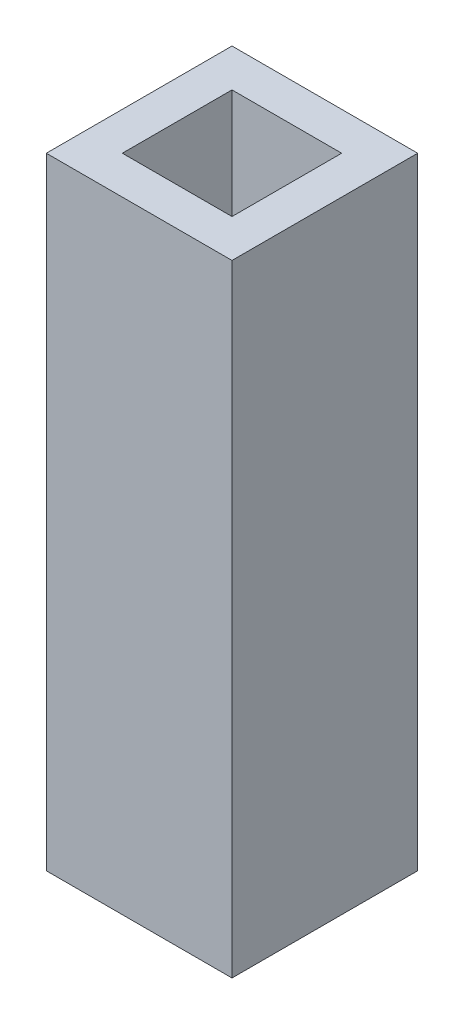
ISO-10303-21;
HEADER;
FILE_DESCRIPTION(('STEP AP214'),'2;1');
FILE_NAME('part.step','',(''),(''),'','','');
FILE_SCHEMA(('AUTOMOTIVE_DESIGN { 1 0 10303 214 1 1 1 1 }'));
ENDSEC;
DATA;
#1=APPLICATION_CONTEXT('core data for automotive mechanical design processes');
#2=APPLICATION_PROTOCOL_DEFINITION('international standard','automotive_design',2000,#1);
#3=PRODUCT_CONTEXT('',#1,'mechanical');
#4=PRODUCT('Part','Part','',(#3));
#5=PRODUCT_RELATED_PRODUCT_CATEGORY('part','',(#4));
#6=PRODUCT_DEFINITION_FORMATION('','',#4);
#7=PRODUCT_DEFINITION_CONTEXT('part definition',#1,'design');
#8=PRODUCT_DEFINITION('design','',#6,#7);
#9=PRODUCT_DEFINITION_SHAPE('','',#8);
#10=(LENGTH_UNIT() NAMED_UNIT(*) SI_UNIT(.MILLI.,.METRE.));
#11=(NAMED_UNIT(*) PLANE_ANGLE_UNIT() SI_UNIT($,.RADIAN.));
#12=(NAMED_UNIT(*) SI_UNIT($,.STERADIAN.) SOLID_ANGLE_UNIT());
#13=UNCERTAINTY_MEASURE_WITH_UNIT(LENGTH_MEASURE(1.E-05),#10,'distance_accuracy_value','');
#14=(GEOMETRIC_REPRESENTATION_CONTEXT(3) GLOBAL_UNCERTAINTY_ASSIGNED_CONTEXT((#13)) GLOBAL_UNIT_ASSIGNED_CONTEXT((#10,
#11,#12)) REPRESENTATION_CONTEXT('',''));
#15=CARTESIAN_POINT('',(0.,0.,0.));
#16=DIRECTION('',(0.,0.,1.));
#17=DIRECTION('',(1.,0.,0.));
#18=AXIS2_PLACEMENT_3D('',#15,#16,#17);
#19=CARTESIAN_POINT('',(0.,8.5,0.));
#20=DIRECTION('',(0.,-1.,0.));
#21=DIRECTION('',(0.,0.,-1.));
#22=AXIS2_PLACEMENT_3D('',#19,#20,#21);
#23=PLANE('',#22);
#24=DIRECTION('',(0.,0.,1.));
#25=VECTOR('',#24,1.);
#26=CARTESIAN_POINT('',(0.,8.5,0.));
#27=LINE('',#26,#25);
#28=CARTESIAN_POINT('',(0.,8.5,-2.54));
#29=VERTEX_POINT('',#28);
#30=CARTESIAN_POINT('',(0.,8.5,0.));
#31=VERTEX_POINT('',#30);
#32=EDGE_CURVE('E136',#29,#31,#27,.T.);
#33=ORIENTED_EDGE('',*,*,#32,.T.);
#34=DIRECTION('',(1.,0.,0.));
#35=VECTOR('',#34,1.);
#36=CARTESIAN_POINT('',(0.,8.5,0.));
#37=LINE('',#36,#35);
#38=CARTESIAN_POINT('',(2.54,8.5,0.));
#39=VERTEX_POINT('',#38);
#40=EDGE_CURVE('E139',#31,#39,#37,.T.);
#41=ORIENTED_EDGE('',*,*,#40,.T.);
#42=DIRECTION('',(0.,0.,-1.));
#43=VECTOR('',#42,1.);
#44=CARTESIAN_POINT('',(2.54,8.5,0.));
#45=LINE('',#44,#43);
#46=CARTESIAN_POINT('',(2.54,8.5,-2.54));
#47=VERTEX_POINT('',#46);
#48=EDGE_CURVE('E142',#39,#47,#45,.T.);
#49=ORIENTED_EDGE('',*,*,#48,.T.);
#50=DIRECTION('',(-1.,0.,0.));
#51=VECTOR('',#50,1.);
#52=CARTESIAN_POINT('',(0.,8.5,-2.54));
#53=LINE('',#52,#51);
#54=EDGE_CURVE('E144',#47,#29,#53,.T.);
#55=ORIENTED_EDGE('',*,*,#54,.T.);
#56=EDGE_LOOP('',(#33,#41,#49,#55));
#57=FACE_BOUND('',#56,.T.);
#58=DIRECTION('',(0.,0.,-1.));
#59=VECTOR('',#58,1.);
#60=CARTESIAN_POINT('',(2.02,8.5,-2.02));
#61=LINE('',#60,#59);
#62=CARTESIAN_POINT('',(2.02,8.5,-0.52));
#63=VERTEX_POINT('',#62);
#64=CARTESIAN_POINT('',(2.02,8.5,-2.02));
#65=VERTEX_POINT('',#64);
#66=EDGE_CURVE('E100',#63,#65,#61,.T.);
#67=ORIENTED_EDGE('',*,*,#66,.F.);
#68=DIRECTION('',(1.,0.,0.));
#69=VECTOR('',#68,1.);
#70=CARTESIAN_POINT('',(0.520000000000001,8.5,-0.52));
#71=LINE('',#70,#69);
#72=CARTESIAN_POINT('',(0.520000000000001,8.5,-0.52));
#73=VERTEX_POINT('',#72);
#74=EDGE_CURVE('E122',#73,#63,#71,.T.);
#75=ORIENTED_EDGE('',*,*,#74,.F.);
#76=DIRECTION('',(0.,0.,1.));
#77=VECTOR('',#76,1.);
#78=CARTESIAN_POINT('',(0.52,8.5,-2.02));
#79=LINE('',#78,#77);
#80=CARTESIAN_POINT('',(0.52,8.5,-2.02));
#81=VERTEX_POINT('',#80);
#82=EDGE_CURVE('E120',#81,#73,#79,.T.);
#83=ORIENTED_EDGE('',*,*,#82,.F.);
#84=DIRECTION('',(-1.,0.,0.));
#85=VECTOR('',#84,1.);
#86=CARTESIAN_POINT('',(0.52,8.5,-2.02));
#87=LINE('',#86,#85);
#88=EDGE_CURVE('E108',#65,#81,#87,.T.);
#89=ORIENTED_EDGE('',*,*,#88,.F.);
#90=EDGE_LOOP('',(#67,#75,#83,#89));
#91=FACE_BOUND('',#90,.T.);
#92=ADVANCED_FACE('F35',(#57,#91),#23,.F.);
#93=CARTESIAN_POINT('',(0.,0.,0.));
#94=DIRECTION('',(0.,-1.,0.));
#95=DIRECTION('',(0.,0.,-1.));
#96=AXIS2_PLACEMENT_3D('',#93,#94,#95);
#97=PLANE('',#96);
#98=DIRECTION('',(0.,0.,1.));
#99=VECTOR('',#98,1.);
#100=CARTESIAN_POINT('',(0.,0.,0.));
#101=LINE('',#100,#99);
#102=CARTESIAN_POINT('',(0.,0.,-2.54));
#103=VERTEX_POINT('',#102);
#104=CARTESIAN_POINT('',(0.,0.,0.));
#105=VERTEX_POINT('',#104);
#106=EDGE_CURVE('E116',#103,#105,#101,.T.);
#107=ORIENTED_EDGE('',*,*,#106,.F.);
#108=DIRECTION('',(-1.,0.,0.));
#109=VECTOR('',#108,1.);
#110=CARTESIAN_POINT('',(0.,0.,-2.54));
#111=LINE('',#110,#109);
#112=CARTESIAN_POINT('',(2.54,0.,-2.54));
#113=VERTEX_POINT('',#112);
#114=EDGE_CURVE('E140',#113,#103,#111,.T.);
#115=ORIENTED_EDGE('',*,*,#114,.F.);
#116=DIRECTION('',(0.,0.,-1.));
#117=VECTOR('',#116,1.);
#118=CARTESIAN_POINT('',(2.54,0.,0.));
#119=LINE('',#118,#117);
#120=CARTESIAN_POINT('',(2.54,0.,0.));
#121=VERTEX_POINT('',#120);
#122=EDGE_CURVE('E151',#121,#113,#119,.T.);
#123=ORIENTED_EDGE('',*,*,#122,.F.);
#124=DIRECTION('',(1.,0.,0.));
#125=VECTOR('',#124,1.);
#126=CARTESIAN_POINT('',(0.,0.,0.));
#127=LINE('',#126,#125);
#128=EDGE_CURVE('E149',#105,#121,#127,.T.);
#129=ORIENTED_EDGE('',*,*,#128,.F.);
#130=EDGE_LOOP('',(#107,#115,#123,#129));
#131=FACE_BOUND('',#130,.T.);
#132=DIRECTION('',(1.,0.,0.));
#133=VECTOR('',#132,1.);
#134=CARTESIAN_POINT('',(0.520000000000001,0.,-0.52));
#135=LINE('',#134,#133);
#136=CARTESIAN_POINT('',(0.520000000000001,0.,-0.52));
#137=VERTEX_POINT('',#136);
#138=CARTESIAN_POINT('',(2.02,0.,-0.52));
#139=VERTEX_POINT('',#138);
#140=EDGE_CURVE('E109',#137,#139,#135,.T.);
#141=ORIENTED_EDGE('',*,*,#140,.T.);
#142=DIRECTION('',(0.,0.,-1.));
#143=VECTOR('',#142,1.);
#144=CARTESIAN_POINT('',(2.02,0.,-2.02));
#145=LINE('',#144,#143);
#146=CARTESIAN_POINT('',(2.02,0.,-2.02));
#147=VERTEX_POINT('',#146);
#148=EDGE_CURVE('E58',#139,#147,#145,.T.);
#149=ORIENTED_EDGE('',*,*,#148,.T.);
#150=DIRECTION('',(-1.,0.,0.));
#151=VECTOR('',#150,1.);
#152=CARTESIAN_POINT('',(0.52,0.,-2.02));
#153=LINE('',#152,#151);
#154=CARTESIAN_POINT('',(0.52,0.,-2.02));
#155=VERTEX_POINT('',#154);
#156=EDGE_CURVE('E115',#147,#155,#153,.T.);
#157=ORIENTED_EDGE('',*,*,#156,.T.);
#158=DIRECTION('',(0.,0.,1.));
#159=VECTOR('',#158,1.);
#160=CARTESIAN_POINT('',(0.52,0.,-2.02));
#161=LINE('',#160,#159);
#162=EDGE_CURVE('E128',#155,#137,#161,.T.);
#163=ORIENTED_EDGE('',*,*,#162,.T.);
#164=EDGE_LOOP('',(#141,#149,#157,#163));
#165=FACE_BOUND('',#164,.T.);
#166=ADVANCED_FACE('F169',(#131,#165),#97,.T.);
#167=CARTESIAN_POINT('',(0.,8.5,0.));
#168=DIRECTION('',(1.,0.,0.));
#169=DIRECTION('',(0.,0.,-1.));
#170=AXIS2_PLACEMENT_3D('',#167,#168,#169);
#171=PLANE('',#170);
#172=ORIENTED_EDGE('',*,*,#106,.T.);
#173=DIRECTION('',(0.,-1.,0.));
#174=VECTOR('',#173,1.);
#175=CARTESIAN_POINT('',(0.,8.5,0.));
#176=LINE('',#175,#174);
#177=EDGE_CURVE('E11',#31,#105,#176,.T.);
#178=ORIENTED_EDGE('',*,*,#177,.F.);
#179=ORIENTED_EDGE('',*,*,#32,.F.);
#180=DIRECTION('',(0.,-1.,0.));
#181=VECTOR('',#180,1.);
#182=CARTESIAN_POINT('',(0.,8.5,-2.54));
#183=LINE('',#182,#181);
#184=EDGE_CURVE('E146',#29,#103,#183,.T.);
#185=ORIENTED_EDGE('',*,*,#184,.T.);
#186=EDGE_LOOP('',(#172,#178,#179,#185));
#187=FACE_BOUND('',#186,.T.);
#188=ADVANCED_FACE('F37',(#187),#171,.F.);
#189=CARTESIAN_POINT('',(0.,8.5,0.));
#190=DIRECTION('',(0.,0.,-1.));
#191=DIRECTION('',(-1.,0.,0.));
#192=AXIS2_PLACEMENT_3D('',#189,#190,#191);
#193=PLANE('',#192);
#194=ORIENTED_EDGE('',*,*,#128,.T.);
#195=DIRECTION('',(0.,-1.,0.));
#196=VECTOR('',#195,1.);
#197=CARTESIAN_POINT('',(2.54,8.5,0.));
#198=LINE('',#197,#196);
#199=EDGE_CURVE('E43',#39,#121,#198,.T.);
#200=ORIENTED_EDGE('',*,*,#199,.F.);
#201=ORIENTED_EDGE('',*,*,#40,.F.);
#202=ORIENTED_EDGE('',*,*,#177,.T.);
#203=EDGE_LOOP('',(#194,#200,#201,#202));
#204=FACE_BOUND('',#203,.T.);
#205=ADVANCED_FACE('F179',(#204),#193,.F.);
#206=CARTESIAN_POINT('',(2.54,8.5,0.));
#207=DIRECTION('',(-1.,0.,0.));
#208=DIRECTION('',(0.,0.,1.));
#209=AXIS2_PLACEMENT_3D('',#206,#207,#208);
#210=PLANE('',#209);
#211=ORIENTED_EDGE('',*,*,#122,.T.);
#212=DIRECTION('',(0.,-1.,0.));
#213=VECTOR('',#212,1.);
#214=CARTESIAN_POINT('',(2.54,8.5,-2.54));
#215=LINE('',#214,#213);
#216=EDGE_CURVE('E156',#47,#113,#215,.T.);
#217=ORIENTED_EDGE('',*,*,#216,.F.);
#218=ORIENTED_EDGE('',*,*,#48,.F.);
#219=ORIENTED_EDGE('',*,*,#199,.T.);
#220=EDGE_LOOP('',(#211,#217,#218,#219));
#221=FACE_BOUND('',#220,.T.);
#222=ADVANCED_FACE('F163',(#221),#210,.F.);
#223=CARTESIAN_POINT('',(0.,8.5,-2.54));
#224=DIRECTION('',(0.,0.,1.));
#225=DIRECTION('',(1.,0.,0.));
#226=AXIS2_PLACEMENT_3D('',#223,#224,#225);
#227=PLANE('',#226);
#228=ORIENTED_EDGE('',*,*,#114,.T.);
#229=ORIENTED_EDGE('',*,*,#184,.F.);
#230=ORIENTED_EDGE('',*,*,#54,.F.);
#231=ORIENTED_EDGE('',*,*,#216,.T.);
#232=EDGE_LOOP('',(#228,#229,#230,#231));
#233=FACE_BOUND('',#232,.T.);
#234=ADVANCED_FACE('F173',(#233),#227,.F.);
#235=CARTESIAN_POINT('',(2.02,8.5,-2.02));
#236=DIRECTION('',(-1.,0.,0.));
#237=DIRECTION('',(0.,0.,1.));
#238=AXIS2_PLACEMENT_3D('',#235,#236,#237);
#239=PLANE('',#238);
#240=ORIENTED_EDGE('',*,*,#148,.F.);
#241=DIRECTION('',(0.,-1.,0.));
#242=VECTOR('',#241,1.);
#243=CARTESIAN_POINT('',(2.02,8.5,-0.52));
#244=LINE('',#243,#242);
#245=EDGE_CURVE('E104',#63,#139,#244,.T.);
#246=ORIENTED_EDGE('',*,*,#245,.F.);
#247=ORIENTED_EDGE('',*,*,#66,.T.);
#248=DIRECTION('',(0.,-1.,0.));
#249=VECTOR('',#248,1.);
#250=CARTESIAN_POINT('',(2.02,8.5,-2.02));
#251=LINE('',#250,#249);
#252=EDGE_CURVE('E103',#65,#147,#251,.T.);
#253=ORIENTED_EDGE('',*,*,#252,.T.);
#254=EDGE_LOOP('',(#240,#246,#247,#253));
#255=FACE_BOUND('',#254,.T.);
#256=ADVANCED_FACE('F102',(#255),#239,.T.);
#257=CARTESIAN_POINT('',(0.52,8.5,-2.02));
#258=DIRECTION('',(0.,0.,1.));
#259=DIRECTION('',(1.,0.,0.));
#260=AXIS2_PLACEMENT_3D('',#257,#258,#259);
#261=PLANE('',#260);
#262=ORIENTED_EDGE('',*,*,#156,.F.);
#263=ORIENTED_EDGE('',*,*,#252,.F.);
#264=ORIENTED_EDGE('',*,*,#88,.T.);
#265=DIRECTION('',(0.,-1.,0.));
#266=VECTOR('',#265,1.);
#267=CARTESIAN_POINT('',(0.52,8.5,-2.02));
#268=LINE('',#267,#266);
#269=EDGE_CURVE('E117',#81,#155,#268,.T.);
#270=ORIENTED_EDGE('',*,*,#269,.T.);
#271=EDGE_LOOP('',(#262,#263,#264,#270));
#272=FACE_BOUND('',#271,.T.);
#273=ADVANCED_FACE('F112',(#272),#261,.T.);
#274=CARTESIAN_POINT('',(0.52,8.5,-2.02));
#275=DIRECTION('',(1.,0.,0.));
#276=DIRECTION('',(0.,0.,-1.));
#277=AXIS2_PLACEMENT_3D('',#274,#275,#276);
#278=PLANE('',#277);
#279=ORIENTED_EDGE('',*,*,#162,.F.);
#280=ORIENTED_EDGE('',*,*,#269,.F.);
#281=ORIENTED_EDGE('',*,*,#82,.T.);
#282=DIRECTION('',(0.,-1.,0.));
#283=VECTOR('',#282,1.);
#284=CARTESIAN_POINT('',(0.520000000000001,8.5,-0.52));
#285=LINE('',#284,#283);
#286=EDGE_CURVE('E50',#73,#137,#285,.T.);
#287=ORIENTED_EDGE('',*,*,#286,.T.);
#288=EDGE_LOOP('',(#279,#280,#281,#287));
#289=FACE_BOUND('',#288,.T.);
#290=ADVANCED_FACE('F202',(#289),#278,.T.);
#291=CARTESIAN_POINT('',(0.520000000000001,8.5,-0.52));
#292=DIRECTION('',(0.,0.,-1.));
#293=DIRECTION('',(-1.,0.,0.));
#294=AXIS2_PLACEMENT_3D('',#291,#292,#293);
#295=PLANE('',#294);
#296=ORIENTED_EDGE('',*,*,#140,.F.);
#297=ORIENTED_EDGE('',*,*,#286,.F.);
#298=ORIENTED_EDGE('',*,*,#74,.T.);
#299=ORIENTED_EDGE('',*,*,#245,.T.);
#300=EDGE_LOOP('',(#296,#297,#298,#299));
#301=FACE_BOUND('',#300,.T.);
#302=ADVANCED_FACE('F206',(#301),#295,.T.);
#303=CLOSED_SHELL('',(#92,#166,#188,#205,#222,#234,#256,#273,#290,#302));
#304=MANIFOLD_SOLID_BREP('B2',#303);
#305=ADVANCED_BREP_SHAPE_REPRESENTATION('',(#18,#304),#14);
#306=SHAPE_DEFINITION_REPRESENTATION(#9,#305);
ENDSEC;
END-ISO-10303-21;
